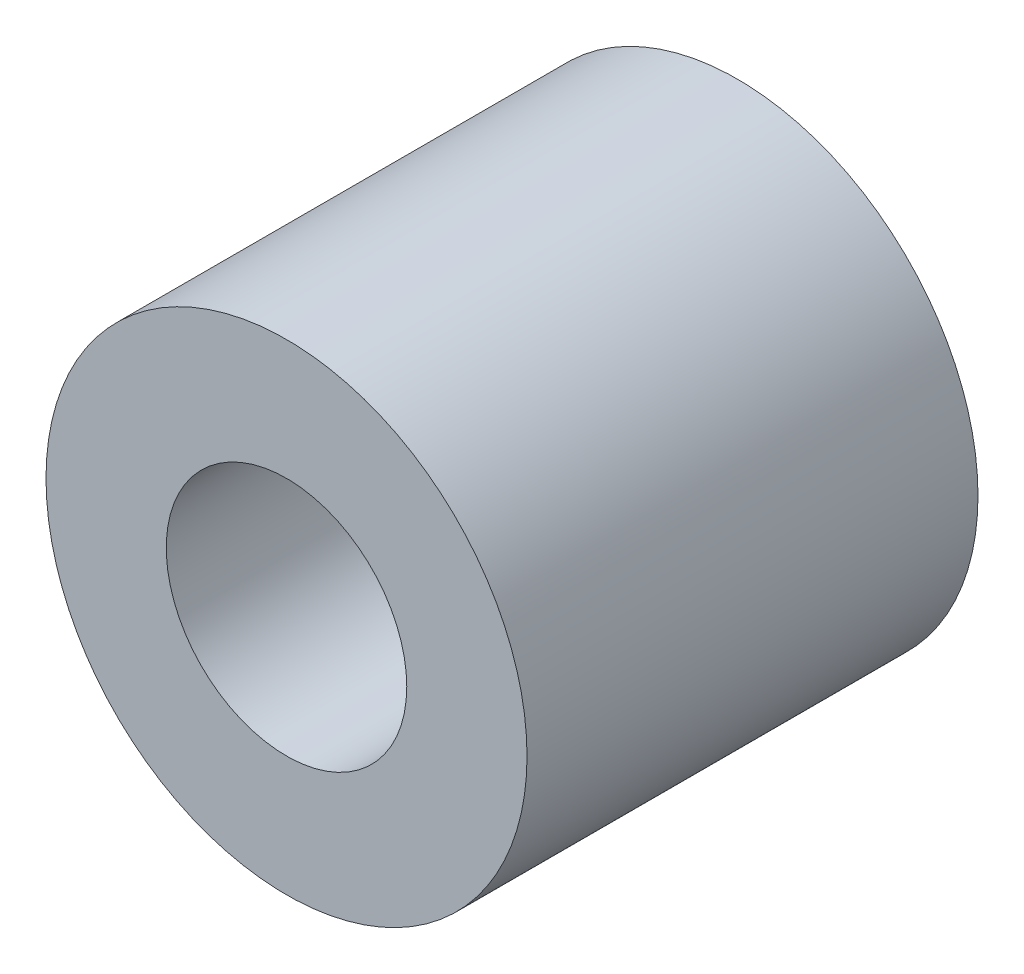
ISO-10303-21;
HEADER;
FILE_DESCRIPTION(('STEP AP214'),'2;1');
FILE_NAME('part.step','',(''),(''),'','','');
FILE_SCHEMA(('AUTOMOTIVE_DESIGN { 1 0 10303 214 1 1 1 1 }'));
ENDSEC;
DATA;
#1=APPLICATION_CONTEXT('core data for automotive mechanical design processes');
#2=APPLICATION_PROTOCOL_DEFINITION('international standard','automotive_design',2000,#1);
#3=PRODUCT_CONTEXT('',#1,'mechanical');
#4=PRODUCT('Part','Part','',(#3));
#5=PRODUCT_RELATED_PRODUCT_CATEGORY('part','',(#4));
#6=PRODUCT_DEFINITION_FORMATION('','',#4);
#7=PRODUCT_DEFINITION_CONTEXT('part definition',#1,'design');
#8=PRODUCT_DEFINITION('design','',#6,#7);
#9=PRODUCT_DEFINITION_SHAPE('','',#8);
#10=(LENGTH_UNIT() NAMED_UNIT(*) SI_UNIT(.MILLI.,.METRE.));
#11=(NAMED_UNIT(*) PLANE_ANGLE_UNIT() SI_UNIT($,.RADIAN.));
#12=(NAMED_UNIT(*) SI_UNIT($,.STERADIAN.) SOLID_ANGLE_UNIT());
#13=UNCERTAINTY_MEASURE_WITH_UNIT(LENGTH_MEASURE(1.E-05),#10,'distance_accuracy_value','');
#14=(GEOMETRIC_REPRESENTATION_CONTEXT(3) GLOBAL_UNCERTAINTY_ASSIGNED_CONTEXT((#13)) GLOBAL_UNIT_ASSIGNED_CONTEXT((#10,
#11,#12)) REPRESENTATION_CONTEXT('',''));
#15=CARTESIAN_POINT('',(0.,0.,0.));
#16=DIRECTION('',(0.,0.,1.));
#17=DIRECTION('',(1.,0.,0.));
#18=AXIS2_PLACEMENT_3D('',#15,#16,#17);
#19=CARTESIAN_POINT('',(0.,0.,15.));
#20=DIRECTION('',(0.,0.,-1.));
#21=DIRECTION('',(-1.,0.,0.));
#22=AXIS2_PLACEMENT_3D('',#19,#20,#21);
#23=CYLINDRICAL_SURFACE('',#22,8.);
#24=CARTESIAN_POINT('',(0.,0.,15.));
#25=DIRECTION('',(0.,0.,1.));
#26=DIRECTION('',(1.,0.,0.));
#27=AXIS2_PLACEMENT_3D('',#24,#25,#26);
#28=CIRCLE('',#27,8.);
#29=CARTESIAN_POINT('',(8.,0.,15.));
#30=VERTEX_POINT('',#29);
#31=EDGE_CURVE('E10',#30,#30,#28,.T.);
#32=ORIENTED_EDGE('',*,*,#31,.F.);
#33=EDGE_LOOP('',(#32));
#34=FACE_BOUND('',#33,.T.);
#35=CARTESIAN_POINT('',(0.,0.,0.));
#36=DIRECTION('',(0.,0.,1.));
#37=DIRECTION('',(1.,0.,0.));
#38=AXIS2_PLACEMENT_3D('',#35,#36,#37);
#39=CIRCLE('',#38,8.);
#40=CARTESIAN_POINT('',(8.,0.,0.));
#41=VERTEX_POINT('',#40);
#42=EDGE_CURVE('E40',#41,#41,#39,.T.);
#43=ORIENTED_EDGE('',*,*,#42,.T.);
#44=EDGE_LOOP('',(#43));
#45=FACE_BOUND('',#44,.T.);
#46=ADVANCED_FACE('F37',(#34,#45),#23,.T.);
#47=CARTESIAN_POINT('',(0.,0.,15.));
#48=DIRECTION('',(0.,0.,1.));
#49=DIRECTION('',(1.,0.,0.));
#50=AXIS2_PLACEMENT_3D('',#47,#48,#49);
#51=PLANE('',#50);
#52=CARTESIAN_POINT('',(0.,0.,15.));
#53=DIRECTION('',(0.,0.,1.));
#54=DIRECTION('',(1.,0.,0.));
#55=AXIS2_PLACEMENT_3D('',#52,#53,#54);
#56=CIRCLE('',#55,4.);
#57=CARTESIAN_POINT('',(4.,0.,15.));
#58=VERTEX_POINT('',#57);
#59=EDGE_CURVE('E51',#58,#58,#56,.T.);
#60=ORIENTED_EDGE('',*,*,#59,.F.);
#61=EDGE_LOOP('',(#60));
#62=FACE_BOUND('',#61,.T.);
#63=ORIENTED_EDGE('',*,*,#31,.T.);
#64=EDGE_LOOP('',(#63));
#65=FACE_BOUND('',#64,.T.);
#66=ADVANCED_FACE('F68',(#62,#65),#51,.T.);
#67=CARTESIAN_POINT('',(0.,0.,0.));
#68=DIRECTION('',(0.,0.,1.));
#69=DIRECTION('',(1.,0.,0.));
#70=AXIS2_PLACEMENT_3D('',#67,#68,#69);
#71=PLANE('',#70);
#72=ORIENTED_EDGE('',*,*,#42,.F.);
#73=EDGE_LOOP('',(#72));
#74=FACE_BOUND('',#73,.T.);
#75=ADVANCED_FACE('F64',(#74),#71,.F.);
#76=CARTESIAN_POINT('',(0.,0.,0.999999999999999));
#77=DIRECTION('',(0.,0.,1.));
#78=DIRECTION('',(1.,0.,0.));
#79=AXIS2_PLACEMENT_3D('',#76,#77,#78);
#80=CYLINDRICAL_SURFACE('',#79,4.);
#81=CARTESIAN_POINT('',(0.,0.,0.999999999999999));
#82=DIRECTION('',(0.,0.,1.));
#83=DIRECTION('',(1.,0.,0.));
#84=AXIS2_PLACEMENT_3D('',#81,#82,#83);
#85=CIRCLE('',#84,4.);
#86=CARTESIAN_POINT('',(4.,0.,0.999999999999999));
#87=VERTEX_POINT('',#86);
#88=EDGE_CURVE('E49',#87,#87,#85,.T.);
#89=ORIENTED_EDGE('',*,*,#88,.F.);
#90=EDGE_LOOP('',(#89));
#91=FACE_BOUND('',#90,.T.);
#92=ORIENTED_EDGE('',*,*,#59,.T.);
#93=EDGE_LOOP('',(#92));
#94=FACE_BOUND('',#93,.T.);
#95=ADVANCED_FACE('F61',(#91,#94),#80,.F.);
#96=CARTESIAN_POINT('',(0.,0.,0.999999999999999));
#97=DIRECTION('',(0.,0.,1.));
#98=DIRECTION('',(1.,0.,0.));
#99=AXIS2_PLACEMENT_3D('',#96,#97,#98);
#100=PLANE('',#99);
#101=ORIENTED_EDGE('',*,*,#88,.T.);
#102=EDGE_LOOP('',(#101));
#103=FACE_BOUND('',#102,.T.);
#104=ADVANCED_FACE('F59',(#103),#100,.T.);
#105=CLOSED_SHELL('',(#46,#66,#75,#95,#104));
#106=MANIFOLD_SOLID_BREP('B2',#105);
#107=ADVANCED_BREP_SHAPE_REPRESENTATION('',(#18,#106),#14);
#108=SHAPE_DEFINITION_REPRESENTATION(#9,#107);
ENDSEC;
END-ISO-10303-21;
